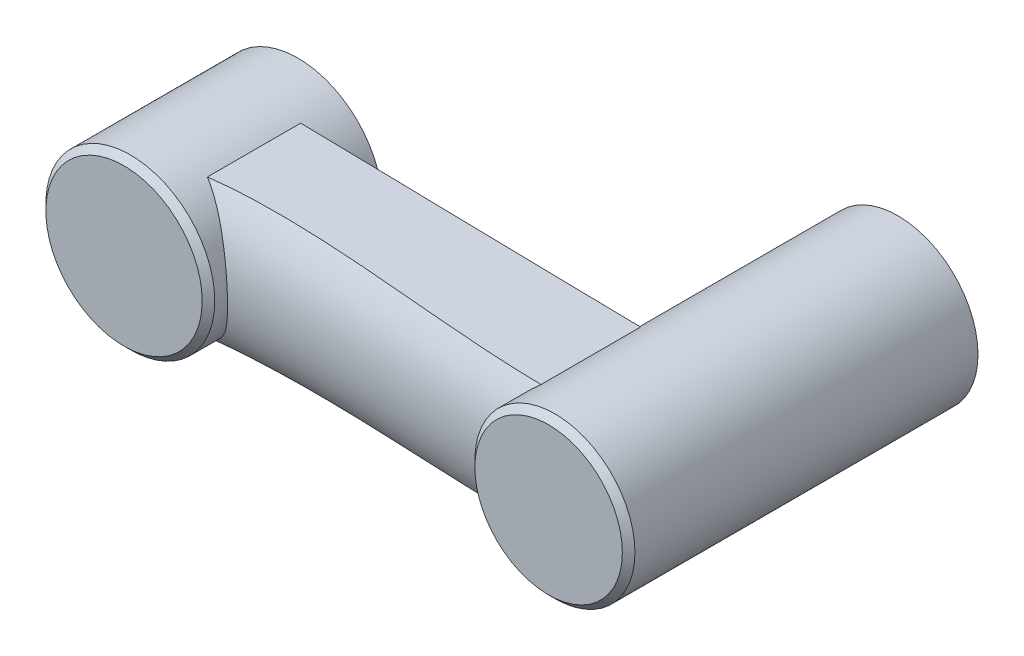
ISO-10303-21;
HEADER;
FILE_DESCRIPTION(('STEP AP214'),'2;1');
FILE_NAME('part.step','',(''),(''),'','','');
FILE_SCHEMA(('AUTOMOTIVE_DESIGN { 1 0 10303 214 1 1 1 1 }'));
ENDSEC;
DATA;
#1=APPLICATION_CONTEXT('core data for automotive mechanical design processes');
#2=APPLICATION_PROTOCOL_DEFINITION('international standard','automotive_design',2000,#1);
#3=PRODUCT_CONTEXT('',#1,'mechanical');
#4=PRODUCT('Part','Part','',(#3));
#5=PRODUCT_RELATED_PRODUCT_CATEGORY('part','',(#4));
#6=PRODUCT_DEFINITION_FORMATION('','',#4);
#7=PRODUCT_DEFINITION_CONTEXT('part definition',#1,'design');
#8=PRODUCT_DEFINITION('design','',#6,#7);
#9=PRODUCT_DEFINITION_SHAPE('','',#8);
#10=(LENGTH_UNIT() NAMED_UNIT(*) SI_UNIT(.MILLI.,.METRE.));
#11=(NAMED_UNIT(*) PLANE_ANGLE_UNIT() SI_UNIT($,.RADIAN.));
#12=(NAMED_UNIT(*) SI_UNIT($,.STERADIAN.) SOLID_ANGLE_UNIT());
#13=UNCERTAINTY_MEASURE_WITH_UNIT(LENGTH_MEASURE(1.E-05),#10,'distance_accuracy_value','');
#14=(GEOMETRIC_REPRESENTATION_CONTEXT(3) GLOBAL_UNCERTAINTY_ASSIGNED_CONTEXT((#13)) GLOBAL_UNIT_ASSIGNED_CONTEXT((#10,
#11,#12)) REPRESENTATION_CONTEXT('',''));
#15=CARTESIAN_POINT('',(0.,0.,0.));
#16=DIRECTION('',(0.,0.,1.));
#17=DIRECTION('',(1.,0.,0.));
#18=AXIS2_PLACEMENT_3D('',#15,#16,#17);
#19=CARTESIAN_POINT('',(0.,0.,138.));
#20=DIRECTION('',(0.,0.,-1.));
#21=DIRECTION('',(-1.,0.,0.));
#22=AXIS2_PLACEMENT_3D('',#19,#20,#21);
#23=CYLINDRICAL_SURFACE('',#22,67.);
#24=CARTESIAN_POINT('',(35.579820698357,-56.7721442176775,29.8996978890331));
#25=CARTESIAN_POINT('',(35.5796146737606,-56.7722733358973,42.1189482688865));
#26=CARTESIAN_POINT('',(35.5794086813852,-56.7724024323619,54.3381986487407));
#27=CARTESIAN_POINT('',(35.5790997411726,-56.7725960444162,72.667074218523));
#28=CARTESIAN_POINT('',(35.5789967691602,-56.7726605763272,78.7766994084507));
#29=CARTESIAN_POINT('',(35.5787908412552,-56.7727896292668,90.9959497883064));
#30=CARTESIAN_POINT('',(35.5786878853626,-56.7728541502954,97.1055749782344));
#31=CARTESIAN_POINT('',(35.5785849375316,-56.7729186658819,103.215200168163));
#32=B_SPLINE_CURVE_WITH_KNOTS('',3,(#24,#25,#26,#27,#28,#29,#30,#31),.UNSPECIFIED.,.F.,.F.,(4,2,
2,4),(0.,36.6577511468172,54.9866267202258,73.3155022936344),.UNSPECIFIED.);
#33=CARTESIAN_POINT('',(35.579820698357,-56.7721442176775,29.8996978890331));
#34=VERTEX_POINT('',#33);
#35=CARTESIAN_POINT('',(35.5785849375317,-56.7729186658819,103.215200168163));
#36=VERTEX_POINT('',#35);
#37=EDGE_CURVE('E148',#34,#36,#32,.T.);
#38=ORIENTED_EDGE('',*,*,#37,.T.);
#39=CARTESIAN_POINT('',(35.5785849375317,-56.7729186658819,103.215200168163));
#40=CARTESIAN_POINT('',(36.4257837523212,-56.2419710708547,103.525527095499));
#41=CARTESIAN_POINT('',(37.2576374105249,-55.694274429655,103.848626487826));
#42=CARTESIAN_POINT('',(38.8896443397991,-54.567194278523,104.515649623776));
#43=CARTESIAN_POINT('',(39.6898282437457,-53.9878427460475,104.859552388343));
#44=CARTESIAN_POINT('',(41.2588728907683,-52.7984287726171,105.56396265906));
#45=CARTESIAN_POINT('',(42.0277452799758,-52.188377942368,105.924463883225));
#46=CARTESIAN_POINT('',(43.5344173928343,-50.9383223769445,106.65806566054));
#47=CARTESIAN_POINT('',(44.2722183638922,-50.2983188464465,107.031165706806));
#48=CARTESIAN_POINT('',(45.7217504726497,-48.9845377736192,107.788689937383));
#49=CARTESIAN_POINT('',(46.433265584902,-48.3105569624297,108.173174667787));
#50=CARTESIAN_POINT('',(47.8248242384611,-46.9334061159926,108.947271825771));
#51=CARTESIAN_POINT('',(48.5048621327896,-46.2302308858914,109.336885157436));
#52=CARTESIAN_POINT('',(49.8332252675441,-44.7951533014568,110.117646832806));
#53=CARTESIAN_POINT('',(50.4815463481064,-44.0632472014545,110.508795370633));
#54=CARTESIAN_POINT('',(51.7460553558377,-42.5711423321715,111.289181175483));
#55=CARTESIAN_POINT('',(52.3622413213631,-41.8109418405418,111.678418324517));
#56=CARTESIAN_POINT('',(53.7608283599795,-40.0059238497514,112.579891921783));
#57=CARTESIAN_POINT('',(54.5306226367113,-38.9502896556969,113.090132369706));
#58=CARTESIAN_POINT('',(56.0104531391091,-36.7905221062414,114.093958144913));
#59=CARTESIAN_POINT('',(56.7204957702228,-35.6863939688115,114.587545254046));
#60=CARTESIAN_POINT('',(58.078673450656,-33.4305413378451,115.551155474619));
#61=CARTESIAN_POINT('',(58.7268025031698,-32.2788122492378,116.021176301392));
#62=CARTESIAN_POINT('',(59.9561494700284,-29.9333805362883,116.929361116309));
#63=CARTESIAN_POINT('',(60.5375810774446,-28.7398289229698,117.367625087986));
#64=CARTESIAN_POINT('',(61.6326420664586,-26.3095723179391,118.207610559228));
#65=CARTESIAN_POINT('',(62.1462758667381,-25.0728701451877,118.609334439739));
#66=CARTESIAN_POINT('',(63.1020323796755,-22.559695205527,119.370178591394));
#67=CARTESIAN_POINT('',(63.5441777065711,-21.2832351683692,119.729312325631));
#68=CARTESIAN_POINT('',(64.2549764452112,-19.0092544947119,120.318084324477));
#69=CARTESIAN_POINT('',(64.5396750209925,-18.0193675681212,120.557977917362));
#70=CARTESIAN_POINT('',(65.0644672967674,-16.0212889200734,121.008119901513));
#71=CARTESIAN_POINT('',(65.3045670498933,-15.0130997030966,121.218372314865));
#72=CARTESIAN_POINT('',(65.7386976045292,-12.9808780191299,121.607331561122));
#73=CARTESIAN_POINT('',(65.9327306243444,-11.9568463175522,121.7860399129));
#74=CARTESIAN_POINT('',(66.2733792089485,-9.89594578846804,122.110256903284));
#75=CARTESIAN_POINT('',(66.4200055975866,-8.85907994745659,122.255773118058));
#76=CARTESIAN_POINT('',(66.6647989491465,-6.77533077885237,122.512356434506));
#77=CARTESIAN_POINT('',(66.7629629394068,-5.72844684076814,122.623421422802));
#78=CARTESIAN_POINT('',(66.9099791170147,-3.62807826105905,122.810140958997));
#79=CARTESIAN_POINT('',(66.9588318031638,-2.57459368631047,122.885795865077));
#80=CARTESIAN_POINT('',(67.0067503850045,-0.462311614829991,123.001258104093));
#81=CARTESIAN_POINT('',(67.0057118266765,0.596492387555919,123.04099005041));
#82=CARTESIAN_POINT('',(66.9533981866723,2.71362006248329,123.084182323484));
#83=CARTESIAN_POINT('',(66.9021221118133,3.77194372511472,123.08764193313));
#84=CARTESIAN_POINT('',(66.7494927730994,5.88444476411658,123.058551587671));
#85=CARTESIAN_POINT('',(66.6481407321454,6.938622241107,123.026002511907));
#86=CARTESIAN_POINT('',(66.3958425505338,9.03944123021915,122.925561386473));
#87=CARTESIAN_POINT('',(66.2448908614308,10.0860818858453,122.857665382236));
#88=CARTESIAN_POINT('',(65.8942053785895,12.1683389080739,122.687586721601));
#89=CARTESIAN_POINT('',(65.6944708459794,13.2039551074505,122.585403545875));
#90=CARTESIAN_POINT('',(65.2472968820391,15.2609963990252,122.348160883964));
#91=CARTESIAN_POINT('',(64.9998590218057,16.282421957401,122.213102480477));
#92=CARTESIAN_POINT('',(64.531564073298,18.0350695282606,121.952462273777));
#93=CARTESIAN_POINT('',(64.3215241454485,18.7702925586666,121.834141310294));
#94=CARTESIAN_POINT('',(63.8772516699615,20.2306546022193,121.58165485781));
#95=CARTESIAN_POINT('',(63.64301775984,20.9557930448406,121.447488476414));
#96=CARTESIAN_POINT('',(62.904942092669,23.1145012575741,121.022465883817));
#97=CARTESIAN_POINT('',(62.3656293001843,24.531726173706,120.709031712237));
#98=CARTESIAN_POINT('',(61.1973339788446,27.3160713408827,120.029197972193));
#99=CARTESIAN_POINT('',(60.5683107524485,28.6831684954506,119.662774363773));
#100=CARTESIAN_POINT('',(59.2256521726318,31.3618683245128,118.884948211302));
#101=CARTESIAN_POINT('',(58.5120125937483,32.6734682232149,118.473543421118));
#102=CARTESIAN_POINT('',(56.9109338836913,35.3969198875424,117.560537904974));
#103=CARTESIAN_POINT('',(56.0129182210147,36.8009274968942,117.054084412727));
#104=CARTESIAN_POINT('',(54.1216056993076,39.5298437621056,116.006886816433));
#105=CARTESIAN_POINT('',(53.1282959475345,40.8547416754263,115.4661380758));
#106=CARTESIAN_POINT('',(51.051630653642,43.4218440014413,114.362822970642));
#107=CARTESIAN_POINT('',(49.968287780481,44.6640600045201,113.800259681662));
#108=CARTESIAN_POINT('',(47.7156547915286,47.0629663496919,112.665763514205));
#109=CARTESIAN_POINT('',(46.5463821194383,48.2196739548327,112.093832555579));
#110=CARTESIAN_POINT('',(44.5838155944558,50.0232625329299,111.169191270201));
#111=CARTESIAN_POINT('',(43.815798298406,50.6973486856194,110.815472235985));
#112=CARTESIAN_POINT('',(42.2486886426731,52.0105092787955,110.11233780206));
#113=CARTESIAN_POINT('',(41.4496018466184,52.6495899388088,109.762921646454));
#114=CARTESIAN_POINT('',(39.8225359540807,53.8907292864934,109.0720711973));
#115=CARTESIAN_POINT('',(38.9946150269488,54.4928564303718,108.730622918556));
#116=CARTESIAN_POINT('',(37.3089938933905,55.660487892744,108.057998499828));
#117=CARTESIAN_POINT('',(36.4512868069545,56.2259836625244,107.726824766957));
#118=CARTESIAN_POINT('',(35.57915632381,56.7725605841932,107.402358471848));
#119=B_SPLINE_CURVE_WITH_KNOTS('',3,(#39,#40,#41,#42,#43,#44,#45,#46,#47,#48,#49,#50,#51,#52,
#53,#54,#55,#56,#57,#58,#59,#60,#61,#62,#63,#64,#65,#66,#67,#68,#69,#70,#71,#72,#73,#74,#75,#76,
#77,#78,#79,#80,#81,#82,#83,#84,#85,#86,#87,#88,#89,#90,#91,#92,#93,#94,#95,#96,#97,#98,#99,
#100,#101,#102,#103,#104,#105,#106,#107,#108,#109,#110,#111,#112,#113,#114,#115,#116,#117,#118),
.UNSPECIFIED.,.F.,.F.,(4,2,2,2,2,2,2,2,2,2,2,2,2,2,2,2,2,2,2,2,2,2,2,2,2,2,2,2,2,2,2,2,2,2,2,2,
2,2,2,4),(0.,3.14011183691526,6.27710819286003,9.41292690169156,12.5486195983206,
15.7060364839292,18.8640176285174,22.0224118582193,25.180998662573,29.3865662930784,
33.5916825058651,37.7972056043585,41.9888542071101,46.1802294866262,50.370276286385,
53.5416228860418,56.7125387427215,59.8833018756009,63.0533405499571,66.2235736488891,
69.3937746794562,72.5706132402538,75.7475146075969,78.9243383959348,82.1015176794817,
85.2787450880152,88.4558678732473,90.7764822642592,93.0972274119788,97.7375838899042,
102.380052222381,107.022752482201,112.243374297295,117.464703431295,122.685299088971,
127.904837880567,131.148044350759,134.39067270944,137.627100552095,140.864280983307),.UNSPECIFIED.);
#120=CARTESIAN_POINT('',(35.57915632381,56.7725605841932,107.402358471848));
#121=VERTEX_POINT('',#120);
#122=EDGE_CURVE('E142',#36,#121,#119,.T.);
#123=ORIENTED_EDGE('',*,*,#122,.T.);
#124=CARTESIAN_POINT('',(35.57915632381,56.7725605841932,107.402358471848));
#125=CARTESIAN_POINT('',(35.5791718466941,56.7725508560585,101.236036213824));
#126=CARTESIAN_POINT('',(35.5791873697596,56.7725411278012,95.0697139557992));
#127=CARTESIAN_POINT('',(35.5792184162534,56.7725216710415,82.7370694397502));
#128=CARTESIAN_POINT('',(35.5792339396816,56.7725119425391,76.5707471817257));
#129=CARTESIAN_POINT('',(35.5792805105107,56.7724827566641,58.0717804076523));
#130=CARTESIAN_POINT('',(35.5793115584557,56.772463298924,45.7391358916034));
#131=CARTESIAN_POINT('',(35.5793426071263,56.7724438406938,33.4064913755545));
#132=B_SPLINE_CURVE_WITH_KNOTS('',3,(#124,#125,#126,#127,#128,#129,#130,#131),.UNSPECIFIED.,.F.,
.F.,(4,2,2,4),(0.,18.4989667741551,36.9979335483102,73.9958670966203),.UNSPECIFIED.);
#133=CARTESIAN_POINT('',(35.5793426071263,56.7724438406938,33.4064913755545));
#134=VERTEX_POINT('',#133);
#135=EDGE_CURVE('E222',#121,#134,#132,.T.);
#136=ORIENTED_EDGE('',*,*,#135,.T.);
#137=CARTESIAN_POINT('',(35.5793426071263,56.7724438406937,33.4064913755545));
#138=CARTESIAN_POINT('',(36.4232103450207,56.243577290829,33.0825771587059));
#139=CARTESIAN_POINT('',(37.2530000851984,55.6973562829839,32.7505314488808));
#140=CARTESIAN_POINT('',(38.8835161664554,54.5715463727435,32.0732441830105));
#141=CARTESIAN_POINT('',(39.6842543592937,53.991971332673,31.7280081287929));
#142=CARTESIAN_POINT('',(41.256345478602,52.8004408412325,31.027185014269));
#143=CARTESIAN_POINT('',(42.0277025698321,52.1884900087184,30.6715994337049));
#144=CARTESIAN_POINT('',(43.5406738940396,50.9330545362352,29.9529400603844));
#145=CARTESIAN_POINT('',(44.2822882612645,50.2895700386263,29.5898663014379));
#146=CARTESIAN_POINT('',(45.7402636775976,48.9673702079244,28.8566091279668));
#147=CARTESIAN_POINT('',(46.4564180807669,48.2884445873566,28.4863941176576));
#148=CARTESIAN_POINT('',(47.8576456961579,46.9000913499533,27.7441430844164));
#149=CARTESIAN_POINT('',(48.5427167004014,46.1906615732354,27.3721069341945));
#150=CARTESIAN_POINT('',(49.8811856043044,44.7419258479605,26.6290528920116));
#151=CARTESIAN_POINT('',(50.5345818644332,44.0026183565137,26.2580350536956));
#152=CARTESIAN_POINT('',(51.8089978038153,42.4947324739826,25.519813862824));
#153=CARTESIAN_POINT('',(52.4300159977924,41.7261527428892,25.1526106858757));
#154=CARTESIAN_POINT('',(53.8407597108101,39.8987902216233,24.3032036338905));
#155=CARTESIAN_POINT('',(54.6175736285533,38.8288025527208,23.8235434728452));
#156=CARTESIAN_POINT('',(56.1098443304217,36.6393292125687,22.8822799022993));
#157=CARTESIAN_POINT('',(56.8253040593426,35.5198459208564,22.4206756267558));
#158=CARTESIAN_POINT('',(58.1923218400064,33.2329411678662,21.5216110392617));
#159=CARTESIAN_POINT('',(58.8438737549851,32.065515118113,21.0841530477245));
#160=CARTESIAN_POINT('',(60.0779350338874,29.6888645947456,20.2407636196486));
#161=CARTESIAN_POINT('',(60.6606586951819,28.4797858556693,19.8347357630467));
#162=CARTESIAN_POINT('',(61.7560740443011,26.0192374879016,19.0583606734095));
#163=CARTESIAN_POINT('',(62.2687705723113,24.7677707964805,18.6880109748676));
#164=CARTESIAN_POINT('',(63.2205160792667,22.2262600595976,17.9883921315545));
#165=CARTESIAN_POINT('',(63.6595870075836,20.9362276470223,17.6591107509637));
#166=CARTESIAN_POINT('',(64.3680465417618,18.6241663975368,17.1172627164899));
#167=CARTESIAN_POINT('',(64.6531958909336,17.6091313914767,16.8953127956669));
#168=CARTESIAN_POINT('',(65.1764115437424,15.5612323904977,16.4805131804072));
#169=CARTESIAN_POINT('',(65.4144842239206,14.5283708308227,16.2876595457145));
#170=CARTESIAN_POINT('',(65.842150956852,12.4474650417249,15.9327917059142));
#171=CARTESIAN_POINT('',(66.0317473603698,11.3994215511261,15.770776005477));
#172=CARTESIAN_POINT('',(66.3612086565121,9.29128160692248,15.4790733469817));
#173=CARTESIAN_POINT('',(66.5010832071059,8.2311875353503,15.3493801120745));
#174=CARTESIAN_POINT('',(66.7301520318325,6.10191947981868,15.1234358666338));
#175=CARTESIAN_POINT('',(66.819343295185,5.03274496027435,15.0271868429458));
#176=CARTESIAN_POINT('',(66.9463054469031,2.88882158989203,14.8689564295165));
#177=CARTESIAN_POINT('',(66.9840767915233,1.81407278860021,14.8069747357203));
#178=CARTESIAN_POINT('',(67.0078066251334,-0.339223101561331,14.7176485371423));
#179=CARTESIAN_POINT('',(66.9936791882846,-1.41777353316549,14.6903615750498));
#180=CARTESIAN_POINT('',(66.913338934554,-3.57326818676862,14.6706759099096));
#181=CARTESIAN_POINT('',(66.8471252674643,-4.65021238226136,14.6782777763649));
#182=CARTESIAN_POINT('',(66.66287269143,-6.7988244774902,14.7280459282373));
#183=CARTESIAN_POINT('',(66.54483495318,-7.87049249586104,14.770211432888));
#184=CARTESIAN_POINT('',(66.2575035795385,-10.0051579889553,14.88841248564));
#185=CARTESIAN_POINT('',(66.0882045952561,-11.0681545469563,14.9644515686941));
#186=CARTESIAN_POINT('',(65.6992378913388,-13.1820001503719,15.1493467388426));
#187=CARTESIAN_POINT('',(65.4795694883972,-14.2328490307891,15.2582032711415));
#188=CARTESIAN_POINT('',(64.9910011662822,-16.3192408002811,15.5073608163587));
#189=CARTESIAN_POINT('',(64.7221025846884,-17.3547841043811,15.6476609749796));
#190=CARTESIAN_POINT('',(64.21400414224,-19.1357653948922,15.9169306329986));
#191=CARTESIAN_POINT('',(63.9857984768785,-19.8854039305139,16.0390608194998));
#192=CARTESIAN_POINT('',(63.5041031728472,-21.3738371841832,16.2986693538579));
#193=CARTESIAN_POINT('',(63.2506120889975,-22.1126312796487,16.4361485790377));
#194=CARTESIAN_POINT('',(62.4531719284802,-24.3111233455591,16.8704062917492));
#195=CARTESIAN_POINT('',(61.8721516984713,-25.7532954311504,17.1890604994515));
#196=CARTESIAN_POINT('',(60.6164186319655,-28.584077894323,17.8777597196949));
#197=CARTESIAN_POINT('',(59.9416619589253,-29.9726628209693,18.2478287767804));
#198=CARTESIAN_POINT('',(58.5038274605596,-32.6904526153172,19.0317631623017));
#199=CARTESIAN_POINT('',(57.7407457866225,-34.0196548920206,19.4456303991013));
#200=CARTESIAN_POINT('',(56.0390351636801,-36.7630554523743,20.3588772863272));
#201=CARTESIAN_POINT('',(55.0903101766323,-38.1695396492141,20.8626213596528));
#202=CARTESIAN_POINT('',(53.0956929198353,-40.8987139937644,21.903977001857));
#203=CARTESIAN_POINT('',(52.0497867268822,-42.2213920887306,22.4415934200818));
#204=CARTESIAN_POINT('',(49.8670226016986,-44.7784008785965,23.5396397851991));
#205=CARTESIAN_POINT('',(48.7301928908353,-46.0127587631942,24.1000626269782));
#206=CARTESIAN_POINT('',(46.3706047525121,-48.389774508106,25.2332564073864));
#207=CARTESIAN_POINT('',(45.1478690940823,-49.5324564960543,25.806024046384));
#208=CARTESIAN_POINT('',(43.2333232314994,-51.1920202401696,26.675753494199));
#209=CARTESIAN_POINT('',(42.5712074403762,-51.7439405193768,26.97193322944));
#210=CARTESIAN_POINT('',(41.2260710008671,-52.821905366841,27.5635478099488));
#211=CARTESIAN_POINT('',(40.5430540918435,-53.3479545202309,27.8589827783417));
#212=CARTESIAN_POINT('',(39.1580898988945,-54.3726454104331,28.4472466097541));
#213=CARTESIAN_POINT('',(38.4561840706783,-54.8713408637033,28.7400795594433));
#214=CARTESIAN_POINT('',(37.0326243675857,-55.8419817336914,29.3225814757797));
#215=CARTESIAN_POINT('',(36.3109668496571,-56.3139221656682,29.6122498447695));
#216=CARTESIAN_POINT('',(35.579820698357,-56.7721442176775,29.8996978890331));
#217=B_SPLINE_CURVE_WITH_KNOTS('',3,(#137,#138,#139,#140,#141,#142,#143,#144,#145,#146,#147,
#148,#149,#150,#151,#152,#153,#154,#155,#156,#157,#158,#159,#160,#161,#162,#163,#164,#165,#166,
#167,#168,#169,#170,#171,#172,#173,#174,#175,#176,#177,#178,#179,#180,#181,#182,#183,#184,#185,
#186,#187,#188,#189,#190,#191,#192,#193,#194,#195,#196,#197,#198,#199,#200,#201,#202,#203,#204,
#205,#206,#207,#208,#209,#210,#211,#212,#213,#214,#215,#216),.UNSPECIFIED.,.F.,.F.,(4,2,2,2,2,2,
2,2,2,2,2,2,2,2,2,2,2,2,2,2,2,2,2,2,2,2,2,2,2,2,2,2,2,2,2,2,2,2,2,4),(0.,3.14138715856986,
6.28147801885035,9.42112210330315,12.5607520149841,15.7217874600029,18.8830470955897,
22.0444701882401,25.2060381772142,29.4233327400763,33.6404247734857,37.8579213586079,
42.0619198028023,46.2656275248207,50.4680797946616,53.6989303782076,56.9293430423896,
60.1595990241449,63.3892272179034,66.6190472438172,69.8488386109879,73.0839797668274,
76.3191737312381,79.5542946170804,82.789753190295,86.0252556580179,89.2606702304706,
91.6392463796152,94.0179585535024,98.7742370371617,103.532747364971,108.291465114884,
113.595488653695,118.900273278024,124.20341771531,129.505161839537,132.239001493804,
134.972354871304,137.700132799327,140.428417281989),.UNSPECIFIED.);
#218=EDGE_CURVE('E123',#134,#34,#217,.T.);
#219=ORIENTED_EDGE('',*,*,#218,.T.);
#220=EDGE_LOOP('',(#38,#123,#136,#219));
#221=FACE_BOUND('',#220,.T.);
#222=CARTESIAN_POINT('',(0.,0.,133.));
#223=DIRECTION('',(0.,0.,1.));
#224=DIRECTION('',(1.,0.,0.));
#225=AXIS2_PLACEMENT_3D('',#222,#223,#224);
#226=CIRCLE('',#225,67.);
#227=CARTESIAN_POINT('',(67.,0.,133.));
#228=VERTEX_POINT('',#227);
#229=EDGE_CURVE('E245',#228,#228,#226,.F.);
#230=ORIENTED_EDGE('',*,*,#229,.T.);
#231=EDGE_LOOP('',(#230));
#232=FACE_BOUND('',#231,.T.);
#233=CARTESIAN_POINT('',(0.,0.,0.));
#234=DIRECTION('',(0.,0.,1.));
#235=DIRECTION('',(1.,0.,0.));
#236=AXIS2_PLACEMENT_3D('',#233,#234,#235);
#237=CIRCLE('',#236,67.);
#238=CARTESIAN_POINT('',(67.,0.,0.));
#239=VERTEX_POINT('',#238);
#240=EDGE_CURVE('E128',#239,#239,#237,.T.);
#241=ORIENTED_EDGE('',*,*,#240,.T.);
#242=EDGE_LOOP('',(#241));
#243=FACE_BOUND('',#242,.T.);
#244=ADVANCED_FACE('F73',(#221,#232,#243),#23,.T.);
#245=CARTESIAN_POINT('',(0.,0.,138.));
#246=DIRECTION('',(0.,0.,1.));
#247=DIRECTION('',(1.,0.,0.));
#248=AXIS2_PLACEMENT_3D('',#245,#246,#247);
#249=PLANE('',#248);
#250=CARTESIAN_POINT('',(0.,0.,138.));
#251=DIRECTION('',(0.,0.,1.));
#252=DIRECTION('',(1.,0.,0.));
#253=AXIS2_PLACEMENT_3D('',#250,#251,#252);
#254=CIRCLE('',#253,62.);
#255=CARTESIAN_POINT('',(62.,0.,138.));
#256=VERTEX_POINT('',#255);
#257=EDGE_CURVE('E249',#256,#256,#254,.T.);
#258=ORIENTED_EDGE('',*,*,#257,.T.);
#259=EDGE_LOOP('',(#258));
#260=FACE_BOUND('',#259,.T.);
#261=ADVANCED_FACE('F231',(#260),#249,.T.);
#262=CARTESIAN_POINT('',(0.,0.,0.));
#263=DIRECTION('',(0.,0.,1.));
#264=DIRECTION('',(1.,0.,0.));
#265=AXIS2_PLACEMENT_3D('',#262,#263,#264);
#266=PLANE('',#265);
#267=ORIENTED_EDGE('',*,*,#240,.F.);
#268=EDGE_LOOP('',(#267));
#269=FACE_BOUND('',#268,.T.);
#270=ADVANCED_FACE('F233',(#269),#266,.F.);
#271=CARTESIAN_POINT('',(0.,0.,138.));
#272=DIRECTION('',(0.,0.,-1.));
#273=DIRECTION('',(-1.,0.,0.));
#274=AXIS2_PLACEMENT_3D('',#271,#272,#273);
#275=CONICAL_SURFACE('',#274,62.,0.785398163397446);
#276=ORIENTED_EDGE('',*,*,#229,.F.);
#277=EDGE_LOOP('',(#276));
#278=FACE_BOUND('',#277,.T.);
#279=ORIENTED_EDGE('',*,*,#257,.F.);
#280=EDGE_LOOP('',(#279));
#281=FACE_BOUND('',#280,.T.);
#282=ADVANCED_FACE('F235',(#278,#281),#275,.T.);
#283=CARTESIAN_POINT('',(0.,54.,112.5));
#284=CARTESIAN_POINT('',(22.3373311606658,56.61304941877,107.977354696167));
#285=CARTESIAN_POINT('',(115.022487156039,59.7116612244441,100.96272884789));
#286=CARTESIAN_POINT('',(229.777060375811,50.7083692105686,111.400354136063));
#287=CARTESIAN_POINT('',(321.714385614158,49.7109007097834,110.964376755147));
#288=CARTESIAN_POINT('',(342.9,49.884,110.376067941542));
#289=CARTESIAN_POINT('',(0.,21.8280783135571,135.944781585096));
#290=CARTESIAN_POINT('',(22.3332850747476,22.6990441017964,130.167288184556));
#291=CARTESIAN_POINT('',(115.026965274503,22.7977741784892,131.935400891004));
#292=CARTESIAN_POINT('',(229.790789448576,20.430937206903,131.843732091169));
#293=CARTESIAN_POINT('',(321.705620353639,19.8281992636469,131.898435049731));
#294=CARTESIAN_POINT('',(342.9,19.8861409850956,131.166181497874));
#295=CARTESIAN_POINT('',(0.,-21.8280783135571,135.944781585096));
#296=CARTESIAN_POINT('',(22.3292389888294,-22.6991961558485,128.912440087848));
#297=CARTESIAN_POINT('',(115.031443392968,-29.9661782880369,127.56997542752));
#298=CARTESIAN_POINT('',(229.804518521341,-19.5934912268489,132.11896185808));
#299=CARTESIAN_POINT('',(321.69685509312,-19.8289251377765,132.042379787983));
#300=CARTESIAN_POINT('',(342.9,-19.8861409850956,131.166181497874));
#301=CARTESIAN_POINT('',(0.,-54.,112.5));
#302=CARTESIAN_POINT('',(22.3251929029112,-56.6132014728221,104.212810406044));
#303=CARTESIAN_POINT('',(115.035921511433,-59.7115750335805,91.6743010604112));
#304=CARTESIAN_POINT('',(229.818247594106,-50.7071990624693,111.781819949706));
#305=CARTESIAN_POINT('',(321.6880898326,-49.711626583913,111.396210969904));
#306=CARTESIAN_POINT('',(342.9,-49.884,110.376067941542));
#307=B_SPLINE_SURFACE_WITH_KNOTS('',3,3,((#283,#284,#285,#286,#287,#288),(#289,#290,#291,#292,
#293,#294),(#295,#296,#297,#298,#299,#300),(#301,#302,#303,#304,#305,#306)),.UNSPECIFIED.,.F.,
.F.,.F.,(4,4),(4,1,1,4),(0.,1.),(0.,0.196168865628486,0.815088130053191,1.),.UNSPECIFIED.);
#308=CARTESIAN_POINT('',(303.763268097833,50.0056618396151,110.912615767406));
#309=CARTESIAN_POINT('',(303.065175636219,49.4592811446293,111.300118579425));
#310=CARTESIAN_POINT('',(302.378581740632,48.8983683455058,111.687864965431));
#311=CARTESIAN_POINT('',(301.028489970264,47.7474042938641,112.461912857122));
#312=CARTESIAN_POINT('',(300.365007684267,47.1573339994909,112.848213236504));
#313=CARTESIAN_POINT('',(299.061930367749,45.9484884269603,113.617055933789));
#314=CARTESIAN_POINT('',(298.422343976795,45.329702944684,113.999596856316));
#315=CARTESIAN_POINT('',(297.167944193754,44.0638532641595,114.758738128903));
#316=CARTESIAN_POINT('',(296.553133429847,43.4167860809067,115.13533784616));
#317=CARTESIAN_POINT('',(295.343014904534,42.0879899575088,115.884341986237));
#318=CARTESIAN_POINT('',(294.747970950641,41.4059741783926,116.256664097464));
#319=CARTESIAN_POINT('',(293.585136070693,40.0139544208372,116.991044001108));
#320=CARTESIAN_POINT('',(293.017341055336,39.3039546713179,117.35310333032));
#321=CARTESIAN_POINT('',(291.910067538801,37.8563998061555,118.064979233201));
#322=CARTESIAN_POINT('',(291.370585715273,37.1188479410207,118.414797241687));
#323=CARTESIAN_POINT('',(290.321075312167,35.6166575317709,119.100273777608));
#324=CARTESIAN_POINT('',(289.811048181666,34.8520176579928,119.435931608188));
#325=CARTESIAN_POINT('',(288.653297634621,33.0313806410566,120.202724737287));
#326=CARTESIAN_POINT('',(288.017824910567,31.9648328300182,120.627451571939));
#327=CARTESIAN_POINT('',(286.805637049623,29.7863453345146,121.443354096719));
#328=CARTESIAN_POINT('',(286.228925841179,28.6744026221685,121.834527543392));
#329=CARTESIAN_POINT('',(285.137898353038,26.4077930038873,122.57885400063));
#330=CARTESIAN_POINT('',(284.623586690495,25.2531229446509,122.932004197509));
#331=CARTESIAN_POINT('',(283.663277924166,22.9097574090002,123.594486772238));
#332=CARTESIAN_POINT('',(283.216990927958,21.7212334902005,123.9040046427));
#333=CARTESIAN_POINT('',(282.393701870579,19.309613862016,124.477071817571));
#334=CARTESIAN_POINT('',(282.016696540725,18.0865197867808,124.740623290627));
#335=CARTESIAN_POINT('',(281.335439990014,15.610968725921,125.21815393177));
#336=CARTESIAN_POINT('',(281.031171472618,14.3585187989465,125.432144884783));
#337=CARTESIAN_POINT('',(280.53769409677,12.0168791111112,125.779840715115));
#338=CARTESIAN_POINT('',(280.338125258131,10.9309261538377,125.920737859156));
#339=CARTESIAN_POINT('',(279.995442690089,8.74582226241443,126.162913668733));
#340=CARTESIAN_POINT('',(279.852324171499,7.64667245602779,126.264195695167));
#341=CARTESIAN_POINT('',(279.623675006575,5.43945823034783,126.426072829814));
#342=CARTESIAN_POINT('',(279.538142235066,4.33139414155917,126.486669439502));
#343=CARTESIAN_POINT('',(279.425341295328,2.11050696849887,126.5665763733));
#344=CARTESIAN_POINT('',(279.398088886785,0.997682678506254,126.585875530101));
#345=CARTESIAN_POINT('',(279.402119646012,-1.22782892673498,126.583022001267));
#346=CARTESIAN_POINT('',(279.433404887955,-2.34051623573284,126.560867846811));
#347=CARTESIAN_POINT('',(279.554259538909,-4.56104493265038,126.475456042573));
#348=CARTESIAN_POINT('',(279.643821581796,-5.66888691520019,126.412203587574));
#349=CARTESIAN_POINT('',(279.840268978465,-7.50049634787715,126.273775208904));
#350=CARTESIAN_POINT('',(279.930941518989,-8.22692640215807,126.209943840122));
#351=CARTESIAN_POINT('',(280.137059490855,-9.67459392238713,126.065072911641));
#352=CARTESIAN_POINT('',(280.252506059373,-10.395831148403,125.984032562019));
#353=CARTESIAN_POINT('',(280.507759634111,-11.8317383219381,125.805180447101));
#354=CARTESIAN_POINT('',(280.647562213679,-12.5464094380282,125.707371729469));
#355=CARTESIAN_POINT('',(280.951102950526,-13.9682737585159,125.49545229466));
#356=CARTESIAN_POINT('',(281.114843248961,-14.675466287902,125.381340119208));
#357=CARTESIAN_POINT('',(281.465675523451,-16.0809874434838,125.137416017103));
#358=CARTESIAN_POINT('',(281.652757915384,-16.7793195787962,125.007610534702));
#359=CARTESIAN_POINT('',(282.049772788499,-18.1664668842058,124.732866233518));
#360=CARTESIAN_POINT('',(282.259707231403,-18.8552812315247,124.587926115555));
#361=CARTESIAN_POINT('',(282.922904177451,-20.9060132529664,124.131369313605));
#362=CARTESIAN_POINT('',(283.40962531648,-22.252479397767,123.797970806435));
#363=CARTESIAN_POINT('',(284.492890268833,-24.9617988790553,123.061269975483));
#364=CARTESIAN_POINT('',(285.093631869914,-26.3222499222116,122.655351789924));
#365=CARTESIAN_POINT('',(286.381699710687,-28.9848037942327,121.792764485573));
#366=CARTESIAN_POINT('',(287.069029879068,-30.286903971972,121.336093064122));
#367=CARTESIAN_POINT('',(288.525278888432,-32.8296994192771,120.378627823258));
#368=CARTESIAN_POINT('',(289.29428914769,-34.0703235576604,119.877784674431));
#369=CARTESIAN_POINT('',(290.907886790676,-36.4853250713583,118.839665577785));
#370=CARTESIAN_POINT('',(291.752470931239,-37.6597052859324,118.302391193612));
#371=CARTESIAN_POINT('',(293.176455721055,-39.5045878339984,117.409401909237));
#372=CARTESIAN_POINT('',(293.73409772649,-40.1963940523034,117.062620278104));
#373=CARTESIAN_POINT('',(294.875402097349,-41.5532645128276,116.359692373561));
#374=CARTESIAN_POINT('',(295.459063523467,-42.2183297187563,116.003546438396));
#375=CARTESIAN_POINT('',(296.6514851634,-43.5213152108198,115.283659053064));
#376=CARTESIAN_POINT('',(297.260246269714,-44.1592345300548,114.919917333033));
#377=CARTESIAN_POINT('',(298.499710293558,-45.4052148291023,114.188026846275));
#378=CARTESIAN_POINT('',(299.130322887219,-46.0133783159046,113.819899581566));
#379=CARTESIAN_POINT('',(300.414866144827,-47.2020044536275,113.07976686547));
#380=CARTESIAN_POINT('',(301.068795635448,-47.7824684949808,112.70776160989));
#381=CARTESIAN_POINT('',(302.399285413934,-48.9152828857529,111.961840877387));
#382=CARTESIAN_POINT('',(303.075841729846,-49.4676381269582,111.587925745388));
#383=CARTESIAN_POINT('',(303.763467210864,-50.0058176739948,111.213983293866));
#384=B_SPLINE_CURVE_WITH_KNOTS('',3,(#308,#309,#310,#311,#312,#313,#314,#315,#316,#317,#318,
#319,#320,#321,#322,#323,#324,#325,#326,#327,#328,#329,#330,#331,#332,#333,#334,#335,#336,#337,
#338,#339,#340,#341,#342,#343,#344,#345,#346,#347,#348,#349,#350,#351,#352,#353,#354,#355,#356,
#357,#358,#359,#360,#361,#362,#363,#364,#365,#366,#367,#368,#369,#370,#371,#372,#373,#374,#375,
#376,#377,#378,#379,#380,#381,#382,#383),.UNSPECIFIED.,.F.,.F.,(4,2,2,2,2,2,2,2,2,2,2,2,2,2,2,2,
2,2,2,2,2,2,2,2,2,2,2,2,2,2,2,2,2,2,2,2,2,4),(0.,2.90228372328604,5.80648855556966,
8.71173343826137,11.6172857002759,14.5525572396412,17.487386890698,20.4218713869256,
23.3565001276651,27.2904204168988,31.224603532251,35.1590775737793,39.0762852331021,
42.9933080326192,46.9093984503674,50.2465566182069,53.5834316041249,56.92018343753,
60.2578374532179,63.5956097346496,66.9329602071621,69.1369126706985,71.3409663216264,
73.5446198077915,75.7484705248593,77.9514193136332,80.1545573626994,84.5600217073216,
89.1802987517493,93.8007855024275,98.4264992180813,103.052014521624,105.912853418794,
108.77358912267,111.634426636943,114.484592008654,117.33461415942,120.184138611414),.UNSPECIFIED.);
#385=CARTESIAN_POINT('',(303.763268097833,50.0056618396151,110.912615767406));
#386=VERTEX_POINT('',#385);
#387=CARTESIAN_POINT('',(303.763467210863,-50.0058176739948,111.213983293866));
#388=VERTEX_POINT('',#387);
#389=EDGE_CURVE('E97',#386,#388,#384,.T.);
#390=CARTESIAN_POINT('',(0.,54.,112.5));
#391=CARTESIAN_POINT('',(22.3373311606658,56.61304941877,107.977354696167));
#392=CARTESIAN_POINT('',(115.022487156039,59.7116612244441,100.96272884789));
#393=CARTESIAN_POINT('',(229.777060375811,50.7083692105686,111.400354136063));
#394=CARTESIAN_POINT('',(321.714385614158,49.7109007097834,110.964376755147));
#395=CARTESIAN_POINT('',(342.9,49.884,110.376067941542));
#396=B_SPLINE_CURVE_WITH_KNOTS('',3,(#390,#391,#392,#393,#394,#395),.UNSPECIFIED.,.F.,.F.,(4,1,
1,4),(0.,0.196168865628486,0.815088130053191,1.),.UNSPECIFIED.);
#397=EDGE_CURVE('E134',#386,#121,#396,.F.);
#398=CARTESIAN_POINT('',(0.,-54.,112.5));
#399=CARTESIAN_POINT('',(22.3251929029112,-56.6132014728221,104.212810406044));
#400=CARTESIAN_POINT('',(115.035921511433,-59.7115750335805,91.6743010604112));
#401=CARTESIAN_POINT('',(229.818247594106,-50.7071990624693,111.781819949706));
#402=CARTESIAN_POINT('',(321.6880898326,-49.711626583913,111.396210969904));
#403=CARTESIAN_POINT('',(342.9,-49.884,110.376067941542));
#404=B_SPLINE_CURVE_WITH_KNOTS('',3,(#398,#399,#400,#401,#402,#403),.UNSPECIFIED.,.F.,.F.,(4,1,
1,4),(0.,0.196168865628486,0.815088130053191,1.),.UNSPECIFIED.);
#405=EDGE_CURVE('E256',#36,#388,#404,.T.);
#406=ORIENTED_EDGE('',*,*,#389,.F.);
#407=ORIENTED_EDGE('',*,*,#397,.T.);
#408=ORIENTED_EDGE('',*,*,#122,.F.);
#409=ORIENTED_EDGE('',*,*,#405,.T.);
#410=EDGE_LOOP('',(#406,#407,#408,#409));
#411=FACE_BOUND('',#410,.T.);
#412=ADVANCED_FACE('F176',(#411),#307,.T.);
#413=CARTESIAN_POINT('',(0.,-54.,112.5));
#414=CARTESIAN_POINT('',(22.3251929029112,-56.6132014728221,104.212810406044));
#415=CARTESIAN_POINT('',(115.035921511433,-59.7115750335805,91.6743010604112));
#416=CARTESIAN_POINT('',(229.818247594106,-50.7071990624693,111.781819949706));
#417=CARTESIAN_POINT('',(321.6880898326,-49.711626583913,111.396210969904));
#418=CARTESIAN_POINT('',(342.9,-49.884,110.376067941542));
#419=CARTESIAN_POINT('',(0.,-54.,85.));
#420=CARTESIAN_POINT('',(22.334316600737,-56.6130871816897,79.4226418401491));
#421=CARTESIAN_POINT('',(115.024096679201,-59.7116874891699,71.1247745886588));
#422=CARTESIAN_POINT('',(229.801050195041,-50.7076987434962,85.0948421872338));
#423=CARTESIAN_POINT('',(321.69951539058,-49.7113111904749,85.0209322281627));
#424=CARTESIAN_POINT('',(342.9,-49.884,84.3596445337367));
#425=CARTESIAN_POINT('',(0.,-54.,57.5));
#426=CARTESIAN_POINT('',(22.3434402985627,-56.6129728905573,54.6324732742541));
#427=CARTESIAN_POINT('',(115.012271846968,-59.7117999447593,50.5752481169065));
#428=CARTESIAN_POINT('',(229.783852795976,-50.708198424523,58.4078644247611));
#429=CARTESIAN_POINT('',(321.710940948559,-49.7109957970368,58.6456534864217));
#430=CARTESIAN_POINT('',(342.9,-49.884,58.3432211259309));
#431=CARTESIAN_POINT('',(0.,-54.,30.));
#432=CARTESIAN_POINT('',(22.3525639963885,-56.6128585994249,29.8423047083592));
#433=CARTESIAN_POINT('',(115.000447014736,-59.7119124003487,30.0257216451542));
#434=CARTESIAN_POINT('',(229.766655396911,-50.7086981055499,31.7208866622884));
#435=CARTESIAN_POINT('',(321.722366506539,-49.7106804035987,32.2703747446806));
#436=CARTESIAN_POINT('',(342.9,-49.884,32.3267977181252));
#437=B_SPLINE_SURFACE_WITH_KNOTS('',3,3,((#413,#414,#415,#416,#417,#418),(#419,#420,#421,#422,
#423,#424),(#425,#426,#427,#428,#429,#430),(#431,#432,#433,#434,#435,#436)),.UNSPECIFIED.,.F.,
.F.,.F.,(4,4),(4,1,1,4),(0.,1.),(0.,0.196168865628486,0.815088130053191,1.),.UNSPECIFIED.);
#438=CARTESIAN_POINT('',(303.763467210863,-50.0058176739948,111.213983293866));
#439=CARTESIAN_POINT('',(303.763432498156,-50.0057905064559,100.630649960625));
#440=CARTESIAN_POINT('',(303.763397796989,-50.0057633478901,90.0473166273832));
#441=CARTESIAN_POINT('',(303.763337259515,-50.0057159686634,71.5781604964295));
#442=CARTESIAN_POINT('',(303.763311418079,-50.0056957440132,63.6923376987174));
#443=CARTESIAN_POINT('',(303.763259748009,-50.0056553046677,47.9206921032933));
#444=CARTESIAN_POINT('',(303.763233919375,-50.0056350899724,40.0348693055811));
#445=CARTESIAN_POINT('',(303.763208097139,-50.0056148802526,32.149046507869));
#446=B_SPLINE_CURVE_WITH_KNOTS('',3,(#438,#439,#440,#441,#442,#443,#444,#445),.UNSPECIFIED.,.F.,
.F.,(4,2,2,4),(0.,31.75,55.407468393341,79.064936786682),.UNSPECIFIED.);
#447=CARTESIAN_POINT('',(303.763208097141,-50.0056148802526,32.149046507869));
#448=VERTEX_POINT('',#447);
#449=EDGE_CURVE('E90',#388,#448,#446,.T.);
#450=CARTESIAN_POINT('',(0.,-54.,30.));
#451=CARTESIAN_POINT('',(22.3525639963885,-56.6128585994249,29.8423047083592));
#452=CARTESIAN_POINT('',(115.000447014736,-59.7119124003487,30.0257216451542));
#453=CARTESIAN_POINT('',(229.766655396911,-50.7086981055499,31.7208866622884));
#454=CARTESIAN_POINT('',(321.722366506539,-49.7106804035987,32.2703747446806));
#455=CARTESIAN_POINT('',(342.9,-49.884,32.3267977181252));
#456=B_SPLINE_CURVE_WITH_KNOTS('',3,(#450,#451,#452,#453,#454,#455),.UNSPECIFIED.,.F.,.F.,(4,1,
1,4),(0.,0.196168865628486,0.815088130053191,1.),.UNSPECIFIED.);
#457=EDGE_CURVE('E129',#34,#448,#456,.T.);
#458=ORIENTED_EDGE('',*,*,#449,.F.);
#459=ORIENTED_EDGE('',*,*,#405,.F.);
#460=ORIENTED_EDGE('',*,*,#37,.F.);
#461=ORIENTED_EDGE('',*,*,#457,.T.);
#462=EDGE_LOOP('',(#458,#459,#460,#461));
#463=FACE_BOUND('',#462,.T.);
#464=ADVANCED_FACE('F201',(#463),#437,.T.);
#465=CARTESIAN_POINT('',(0.,54.,30.));
#466=CARTESIAN_POINT('',(22.341422238983,56.6129981704733,32.9960265240046));
#467=CARTESIAN_POINT('',(115.017339099172,59.7117073927333,37.8068943341855));
#468=CARTESIAN_POINT('',(229.768120196695,50.7086271894255,31.4028943275395));
#469=CARTESIAN_POINT('',(321.720253573987,49.7107387294208,31.9076483671306));
#470=CARTESIAN_POINT('',(342.9,49.884,32.3267977181252));
#471=CARTESIAN_POINT('',(0.,54.,57.5));
#472=CARTESIAN_POINT('',(22.3400585462106,56.6130152532388,57.9898025813921));
#473=CARTESIAN_POINT('',(115.019055118127,59.7116920033036,58.858839172087));
#474=CARTESIAN_POINT('',(229.7711002564,50.7085411964732,58.068714263714));
#475=CARTESIAN_POINT('',(321.718297587377,49.710792722875,58.2598911631359));
#476=CARTESIAN_POINT('',(342.9,49.884,58.3432211259309));
#477=CARTESIAN_POINT('',(0.,54.,85.));
#478=CARTESIAN_POINT('',(22.3386948534382,56.6130323360044,82.9835786387797));
#479=CARTESIAN_POINT('',(115.020771137083,59.7116766138738,79.9107840099886));
#480=CARTESIAN_POINT('',(229.774080316106,50.7084552035209,84.7345341998886));
#481=CARTESIAN_POINT('',(321.716341600768,49.7108467163292,84.6121339591413));
#482=CARTESIAN_POINT('',(342.9,49.884,84.3596445337367));
#483=CARTESIAN_POINT('',(0.,54.,112.5));
#484=CARTESIAN_POINT('',(22.3373311606658,56.61304941877,107.977354696167));
#485=CARTESIAN_POINT('',(115.022487156039,59.711661224444,100.96272884789));
#486=CARTESIAN_POINT('',(229.777060375811,50.7083692105686,111.400354136063));
#487=CARTESIAN_POINT('',(321.714385614158,49.7109007097834,110.964376755147));
#488=CARTESIAN_POINT('',(342.9,49.884,110.376067941542));
#489=B_SPLINE_SURFACE_WITH_KNOTS('',3,3,((#465,#466,#467,#468,#469,#470),(#471,#472,#473,#474,
#475,#476),(#477,#478,#479,#480,#481,#482),(#483,#484,#485,#486,#487,#488)),.UNSPECIFIED.,.F.,
.F.,.F.,(4,4),(4,1,1,4),(0.,1.),(0.,0.196168865628486,0.815088130053191,1.),.UNSPECIFIED.);
#490=CARTESIAN_POINT('',(303.763223744847,50.0056271268951,31.8962210425052));
#491=CARTESIAN_POINT('',(303.76322968458,50.0056317756119,42.4795543758359));
#492=CARTESIAN_POINT('',(303.763235624649,50.0056364245904,53.0628877091665));
#493=CARTESIAN_POINT('',(303.763245986812,50.0056445345047,71.5239534966486));
#494=CARTESIAN_POINT('',(303.763250408755,50.0056479953238,79.4016859508001));
#495=CARTESIAN_POINT('',(303.763259253015,50.0056549172521,95.157150859103));
#496=CARTESIAN_POINT('',(303.763263675331,50.0056583783611,103.034883313254));
#497=CARTESIAN_POINT('',(303.763268097833,50.0056618396151,110.912615767406));
#498=B_SPLINE_CURVE_WITH_KNOTS('',3,(#490,#491,#492,#493,#494,#495,#496,#497),.UNSPECIFIED.,.F.,
.F.,(4,2,2,4),(0.,31.75,55.3831973624604,79.0163947249208),.UNSPECIFIED.);
#499=CARTESIAN_POINT('',(303.763223744849,50.0056271268956,31.8962210425052));
#500=VERTEX_POINT('',#499);
#501=EDGE_CURVE('E132',#500,#386,#498,.T.);
#502=CARTESIAN_POINT('',(0.,54.,30.));
#503=CARTESIAN_POINT('',(22.341422238983,56.6129981704732,32.9960265240046));
#504=CARTESIAN_POINT('',(115.017339099172,59.7117073927333,37.8068943341854));
#505=CARTESIAN_POINT('',(229.768120196695,50.7086271894255,31.4028943275394));
#506=CARTESIAN_POINT('',(321.720253573987,49.7107387294208,31.9076483671306));
#507=CARTESIAN_POINT('',(342.9,49.884,32.3267977181252));
#508=B_SPLINE_CURVE_WITH_KNOTS('',3,(#502,#503,#504,#505,#506,#507),.UNSPECIFIED.,.F.,.F.,(4,1,
1,4),(0.,0.196168865628486,0.815088130053191,1.),.UNSPECIFIED.);
#509=EDGE_CURVE('E117',#134,#500,#508,.T.);
#510=ORIENTED_EDGE('',*,*,#501,.F.);
#511=ORIENTED_EDGE('',*,*,#509,.F.);
#512=ORIENTED_EDGE('',*,*,#135,.F.);
#513=ORIENTED_EDGE('',*,*,#397,.F.);
#514=EDGE_LOOP('',(#510,#511,#512,#513));
#515=FACE_BOUND('',#514,.T.);
#516=ADVANCED_FACE('F133',(#515),#489,.T.);
#517=CARTESIAN_POINT('',(0.,-54.,30.));
#518=CARTESIAN_POINT('',(22.3525639963885,-56.6128585994249,29.8423047083591));
#519=CARTESIAN_POINT('',(115.000447014736,-59.7119124003486,30.0257216451541));
#520=CARTESIAN_POINT('',(229.766655396911,-50.7086981055499,31.7208866622884));
#521=CARTESIAN_POINT('',(321.722366506539,-49.7106804035987,32.2703747446806));
#522=CARTESIAN_POINT('',(342.9,-49.884,32.3267977181252));
#523=CARTESIAN_POINT('',(0.,-20.9065519149147,9.56444262833654));
#524=CARTESIAN_POINT('',(22.3488500772533,-21.7774582577068,10.4579879419108));
#525=CARTESIAN_POINT('',(115.006077709548,-22.124917943678,3.37785003936219));
#526=CARTESIAN_POINT('',(229.767143663506,-19.5645367007779,13.9056785992832));
#527=CARTESIAN_POINT('',(321.721662195688,-19.0250082019045,14.0988614133208));
#528=CARTESIAN_POINT('',(342.9,-19.0828008426456,14.276193179282));
#529=CARTESIAN_POINT('',(0.,20.9065519149147,9.56444262833654));
#530=CARTESIAN_POINT('',(22.3451361581182,21.7775978287552,11.509228547126));
#531=CARTESIAN_POINT('',(115.01170840436,27.3339711716481,6.77112590356666));
#532=CARTESIAN_POINT('',(229.7676319301,18.9567538980123,13.7064054881758));
#533=CARTESIAN_POINT('',(321.720957884837,19.0250665277266,13.9779526208041));
#534=CARTESIAN_POINT('',(342.9,19.0828008426457,14.276193179282));
#535=CARTESIAN_POINT('',(0.,54.,30.));
#536=CARTESIAN_POINT('',(22.341422238983,56.6129981704732,32.9960265240046));
#537=CARTESIAN_POINT('',(115.017339099172,59.7117073927333,37.8068943341854));
#538=CARTESIAN_POINT('',(229.768120196695,50.7086271894255,31.4028943275394));
#539=CARTESIAN_POINT('',(321.720253573987,49.7107387294208,31.9076483671306));
#540=CARTESIAN_POINT('',(342.9,49.884,32.3267977181252));
#541=B_SPLINE_SURFACE_WITH_KNOTS('',3,3,((#517,#518,#519,#520,#521,#522),(#523,#524,#525,#526,
#527,#528),(#529,#530,#531,#532,#533,#534),(#535,#536,#537,#538,#539,#540)),.UNSPECIFIED.,.F.,
.F.,.F.,(4,4),(4,1,1,4),(0.,1.),(0.,0.196168865628486,0.815088130053191,1.),.UNSPECIFIED.);
#542=CARTESIAN_POINT('',(303.763208097139,-50.0056148802526,32.149046507869));
#543=CARTESIAN_POINT('',(303.058389487035,-49.4539744152592,31.8136443039657));
#544=CARTESIAN_POINT('',(302.365590368847,-48.8877420161182,31.4769890204941));
#545=CARTESIAN_POINT('',(301.004332551648,-47.7263480184468,30.8031493372824));
#546=CARTESIAN_POINT('',(300.335884924837,-47.1311735406667,30.4659647678058));
#547=CARTESIAN_POINT('',(299.024100081365,-45.912492594438,29.7932637099383));
#548=CARTESIAN_POINT('',(298.380769250939,-45.2889790065389,29.4577476644697));
#549=CARTESIAN_POINT('',(297.120052455127,-44.0142034644641,28.7904798042214));
#550=CARTESIAN_POINT('',(296.502668539263,-43.3629393264497,28.4587282883038));
#551=CARTESIAN_POINT('',(295.289680863079,-42.0277023394238,27.7982746749596));
#552=CARTESIAN_POINT('',(294.694299906986,-41.3435032176135,27.4696206078285));
#553=CARTESIAN_POINT('',(293.531732992571,-39.9480765695358,26.8202006235189));
#554=CARTESIAN_POINT('',(292.964544035449,-39.2368519322517,26.499433869204));
#555=CARTESIAN_POINT('',(291.859328485325,-37.7879601695157,25.8677173612885));
#556=CARTESIAN_POINT('',(291.321299464399,-37.0502952540659,25.5567667912725));
#557=CARTESIAN_POINT('',(290.275430866935,-35.5491440713585,24.9465565389252));
#558=CARTESIAN_POINT('',(289.767592578066,-34.7856567049193,24.6472973554315));
#559=CARTESIAN_POINT('',(288.616474110179,-32.9706280104383,23.9632226149723));
#560=CARTESIAN_POINT('',(287.98560440526,-31.9091375462874,23.5837743830618));
#561=CARTESIAN_POINT('',(286.783085831063,-29.7435043449441,22.8536078944538));
#562=CARTESIAN_POINT('',(286.211439623774,-28.6393596935836,22.5028909293225));
#563=CARTESIAN_POINT('',(285.1305065966,-26.3911220866868,21.834427848955));
#564=CARTESIAN_POINT('',(284.621223400662,-25.2470268145601,21.5166836499462));
#565=CARTESIAN_POINT('',(283.670006749324,-22.9265035662676,20.9193288864194));
#566=CARTESIAN_POINT('',(283.227838049293,-21.7502064242092,20.6395855044644));
#567=CARTESIAN_POINT('',(282.411825927921,-19.3654067524954,20.120635787636));
#568=CARTESIAN_POINT('',(282.037980169509,-18.1569053260487,19.88142806621));
#569=CARTESIAN_POINT('',(281.361604700707,-15.7125259683304,19.4469272999756));
#570=CARTESIAN_POINT('',(281.059061890084,-14.4766531116303,19.2516261886685));
#571=CARTESIAN_POINT('',(280.560328648223,-12.135383762381,18.9287769480886));
#572=CARTESIAN_POINT('',(280.355654550823,-11.0325259030138,18.7958625748691));
#573=CARTESIAN_POINT('',(280.004618635623,-8.81375679592227,18.5675299884709));
#574=CARTESIAN_POINT('',(279.858253053369,-7.69784639567211,18.4721093546661));
#575=CARTESIAN_POINT('',(279.624909135425,-5.45724711889681,18.3198641681804));
#576=CARTESIAN_POINT('',(279.537928916879,-4.33255852183424,18.2630383918226));
#577=CARTESIAN_POINT('',(279.424000189968,-2.07866383559191,18.18860540609));
#578=CARTESIAN_POINT('',(279.3970610191,-0.949457071105336,18.1710042968782));
#579=CARTESIAN_POINT('',(279.403447163598,1.30873155410732,18.1751749422807));
#580=CARTESIAN_POINT('',(279.436774343991,2.43771340679187,18.1969479153803));
#581=CARTESIAN_POINT('',(279.56344465869,4.69078847637991,18.2795095977129));
#582=CARTESIAN_POINT('',(279.656780801527,5.81488224742188,18.3402937618635));
#583=CARTESIAN_POINT('',(279.861812758255,7.68127944168149,18.4734330590365));
#584=CARTESIAN_POINT('',(279.957074832949,8.42620592121735,18.5352141465957));
#585=CARTESIAN_POINT('',(280.173691071636,9.91074044023091,18.6753984013714));
#586=CARTESIAN_POINT('',(280.295046471674,10.6503482260452,18.753802356014));
#587=CARTESIAN_POINT('',(280.563439801461,12.122841002571,18.9267708557022));
#588=CARTESIAN_POINT('',(280.710473330068,12.8557271227322,19.0213326312944));
#589=CARTESIAN_POINT('',(281.029802703739,14.3138310157191,19.226114575976));
#590=CARTESIAN_POINT('',(281.202100812098,15.0390480952764,19.3363361479013));
#591=CARTESIAN_POINT('',(281.571407225749,16.4805057648857,19.5718202451228));
#592=CARTESIAN_POINT('',(281.768409471666,17.1967485089205,19.6970790817913));
#593=CARTESIAN_POINT('',(282.186609635126,18.6194577554093,19.9620142749007));
#594=CARTESIAN_POINT('',(282.40780963524,19.3259234104986,20.1016918722277));
#595=CARTESIAN_POINT('',(283.106831546822,21.4291627586322,20.5413193131264));
#596=CARTESIAN_POINT('',(283.620145808549,22.8100528441792,20.8619089570225));
#597=CARTESIAN_POINT('',(284.762847506024,25.5867599251455,21.5684166616673));
#598=CARTESIAN_POINT('',(285.396593315542,26.9801650197602,21.9567160788168));
#599=CARTESIAN_POINT('',(286.756653928664,29.7068316202105,22.7796445176452));
#600=CARTESIAN_POINT('',(287.482973835839,31.0400898046805,23.2142760933807));
#601=CARTESIAN_POINT('',(289.023090494802,33.6424861166418,24.1224586383712));
#602=CARTESIAN_POINT('',(289.836951202069,34.911576355579,24.596038001784));
#603=CARTESIAN_POINT('',(291.546513454768,37.3807963194145,25.5739551909181));
#604=CARTESIAN_POINT('',(292.44220828013,38.5809316936023,26.0782904898883));
#605=CARTESIAN_POINT('',(293.888728127297,40.3833581194109,26.8767368213276));
#606=CARTESIAN_POINT('',(294.412694879004,41.0109490647632,27.1629660729202));
#607=CARTESIAN_POINT('',(295.483109140904,42.2439918903255,27.7408912609608));
#608=CARTESIAN_POINT('',(296.029554574161,42.8494458061845,28.0325866910068));
#609=CARTESIAN_POINT('',(297.144277633312,44.0377974466005,28.6200795119932));
#610=CARTESIAN_POINT('',(297.712554787011,44.6206956584652,28.9158768141262));
#611=CARTESIAN_POINT('',(298.868548394619,45.7617609200957,29.509257071888));
#612=CARTESIAN_POINT('',(299.456198423113,46.3199996797667,29.8068315384604));
#613=CARTESIAN_POINT('',(300.65207485207,47.4132813410172,30.4032697897803));
#614=CARTESIAN_POINT('',(301.260301517108,47.9483239441373,30.7021335910629));
#615=CARTESIAN_POINT('',(302.496829941099,48.9947919611915,31.299679972017));
#616=CARTESIAN_POINT('',(303.125131707348,49.506217366541,31.5983625516226));
#617=CARTESIAN_POINT('',(303.763223744848,50.0056271268951,31.8962210425052));
#618=B_SPLINE_CURVE_WITH_KNOTS('',3,(#542,#543,#544,#545,#546,#547,#548,#549,#550,#551,#552,
#553,#554,#555,#556,#557,#558,#559,#560,#561,#562,#563,#564,#565,#566,#567,#568,#569,#570,#571,
#572,#573,#574,#575,#576,#577,#578,#579,#580,#581,#582,#583,#584,#585,#586,#587,#588,#589,#590,
#591,#592,#593,#594,#595,#596,#597,#598,#599,#600,#601,#602,#603,#604,#605,#606,#607,#608,#609,
#610,#611,#612,#613,#614,#615,#616,#617),.UNSPECIFIED.,.F.,.F.,(4,2,2,2,2,2,2,2,2,2,2,2,2,2,2,2,
2,2,2,2,2,2,2,2,2,2,2,2,2,2,2,2,2,2,2,2,2,4),(0.,2.86723790544042,5.73576362363624,
8.60501400978602,11.474490611058,14.3677388224265,17.2606786156179,20.1533771646928,
23.0461990023313,26.9191885178691,30.7923520417628,34.6657405304274,38.5252221706543,
42.3845717677598,46.2432117467532,49.6297024738133,53.0159745303712,56.4021392178055,
59.7888304798927,63.1756265496038,66.5620281049867,68.8220194394223,71.0821178536868,
73.3418292745466,75.6017432526809,77.8611040043433,80.1206593601535,84.6389129590041,
89.37198930803,94.1053267025798,98.8421459690818,103.578576605526,106.176737709108,
108.774659290275,111.37252471291,113.962257342551,116.552023283781,119.14179016635),.UNSPECIFIED.);
#619=EDGE_CURVE('E121',#448,#500,#618,.T.);
#620=ORIENTED_EDGE('',*,*,#619,.F.);
#621=ORIENTED_EDGE('',*,*,#457,.F.);
#622=ORIENTED_EDGE('',*,*,#218,.F.);
#623=ORIENTED_EDGE('',*,*,#509,.T.);
#624=EDGE_LOOP('',(#620,#621,#622,#623));
#625=FACE_BOUND('',#624,.T.);
#626=ADVANCED_FACE('F119',(#625),#541,.T.);
#627=CARTESIAN_POINT('',(342.9,0.,-133.2));
#628=DIRECTION('',(0.,0.,1.));
#629=DIRECTION('',(1.,0.,0.));
#630=AXIS2_PLACEMENT_3D('',#627,#628,#629);
#631=CYLINDRICAL_SURFACE('',#630,63.5);
#632=CARTESIAN_POINT('',(342.9,0.,139.));
#633=DIRECTION('',(0.,0.,1.));
#634=DIRECTION('',(1.,0.,0.));
#635=AXIS2_PLACEMENT_3D('',#632,#633,#634);
#636=CIRCLE('',#635,63.5);
#637=CARTESIAN_POINT('',(406.4,0.,139.));
#638=VERTEX_POINT('',#637);
#639=EDGE_CURVE('E12',#638,#638,#636,.F.);
#640=ORIENTED_EDGE('',*,*,#639,.T.);
#641=EDGE_LOOP('',(#640));
#642=FACE_BOUND('',#641,.T.);
#643=ORIENTED_EDGE('',*,*,#501,.T.);
#644=ORIENTED_EDGE('',*,*,#389,.T.);
#645=ORIENTED_EDGE('',*,*,#449,.T.);
#646=ORIENTED_EDGE('',*,*,#619,.T.);
#647=EDGE_LOOP('',(#643,#644,#645,#646));
#648=FACE_BOUND('',#647,.T.);
#649=CARTESIAN_POINT('',(342.9,0.,-133.2));
#650=DIRECTION('',(0.,0.,1.));
#651=DIRECTION('',(1.,0.,0.));
#652=AXIS2_PLACEMENT_3D('',#649,#650,#651);
#653=CIRCLE('',#652,63.5);
#654=CARTESIAN_POINT('',(406.4,0.,-133.2));
#655=VERTEX_POINT('',#654);
#656=EDGE_CURVE('E137',#655,#655,#653,.T.);
#657=ORIENTED_EDGE('',*,*,#656,.T.);
#658=EDGE_LOOP('',(#657));
#659=FACE_BOUND('',#658,.T.);
#660=ADVANCED_FACE('F139',(#642,#648,#659),#631,.T.);
#661=CARTESIAN_POINT('',(342.9,0.,-133.2));
#662=DIRECTION('',(0.,0.,1.));
#663=DIRECTION('',(1.,0.,0.));
#664=AXIS2_PLACEMENT_3D('',#661,#662,#663);
#665=PLANE('',#664);
#666=ORIENTED_EDGE('',*,*,#656,.F.);
#667=EDGE_LOOP('',(#666));
#668=FACE_BOUND('',#667,.T.);
#669=ADVANCED_FACE('F173',(#668),#665,.F.);
#670=CARTESIAN_POINT('',(342.9,0.,144.));
#671=DIRECTION('',(0.,0.,1.));
#672=DIRECTION('',(1.,0.,0.));
#673=AXIS2_PLACEMENT_3D('',#670,#671,#672);
#674=PLANE('',#673);
#675=CARTESIAN_POINT('',(342.9,0.,144.));
#676=DIRECTION('',(0.,0.,1.));
#677=DIRECTION('',(1.,0.,0.));
#678=AXIS2_PLACEMENT_3D('',#675,#676,#677);
#679=CIRCLE('',#678,58.5);
#680=CARTESIAN_POINT('',(401.4,0.,144.));
#681=VERTEX_POINT('',#680);
#682=EDGE_CURVE('E83',#681,#681,#679,.T.);
#683=ORIENTED_EDGE('',*,*,#682,.T.);
#684=EDGE_LOOP('',(#683));
#685=FACE_BOUND('',#684,.T.);
#686=ADVANCED_FACE('F296',(#685),#674,.T.);
#687=CARTESIAN_POINT('',(342.9,0.,144.));
#688=DIRECTION('',(0.,0.,-1.));
#689=DIRECTION('',(-1.,0.,0.));
#690=AXIS2_PLACEMENT_3D('',#687,#688,#689);
#691=CONICAL_SURFACE('',#690,58.5,0.785398163397455);
#692=ORIENTED_EDGE('',*,*,#639,.F.);
#693=EDGE_LOOP('',(#692));
#694=FACE_BOUND('',#693,.T.);
#695=ORIENTED_EDGE('',*,*,#682,.F.);
#696=EDGE_LOOP('',(#695));
#697=FACE_BOUND('',#696,.T.);
#698=ADVANCED_FACE('F76',(#694,#697),#691,.T.);
#699=CLOSED_SHELL('',(#244,#261,#270,#282,#412,#464,#516,#626,#660,#669,#686,#698));
#700=MANIFOLD_SOLID_BREP('B2',#699);
#701=ADVANCED_BREP_SHAPE_REPRESENTATION('',(#18,#700),#14);
#702=SHAPE_DEFINITION_REPRESENTATION(#9,#701);
ENDSEC;
END-ISO-10303-21;
